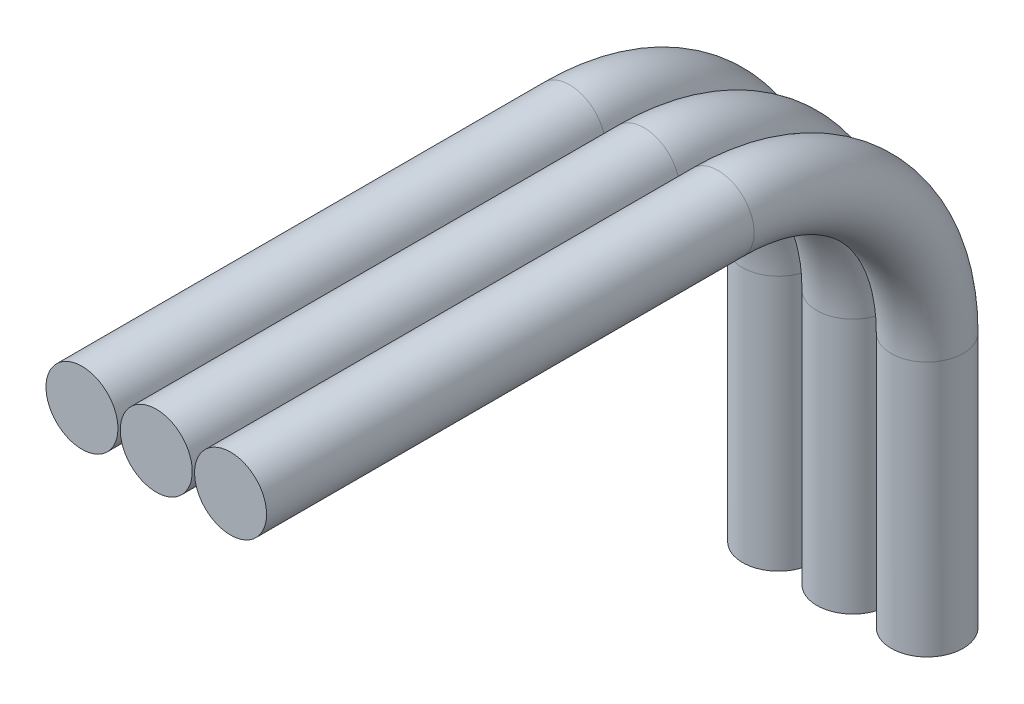
ISO-10303-21;
HEADER;
FILE_DESCRIPTION(('STEP AP214'),'2;1');
FILE_NAME('part.step','',(''),(''),'','','');
FILE_SCHEMA(('AUTOMOTIVE_DESIGN { 1 0 10303 214 1 1 1 1 }'));
ENDSEC;
DATA;
#1=APPLICATION_CONTEXT('core data for automotive mechanical design processes');
#2=APPLICATION_PROTOCOL_DEFINITION('international standard','automotive_design',2000,#1);
#3=PRODUCT_CONTEXT('',#1,'mechanical');
#4=PRODUCT('Part','Part','',(#3));
#5=PRODUCT_RELATED_PRODUCT_CATEGORY('part','',(#4));
#6=PRODUCT_DEFINITION_FORMATION('','',#4);
#7=PRODUCT_DEFINITION_CONTEXT('part definition',#1,'design');
#8=PRODUCT_DEFINITION('design','',#6,#7);
#9=PRODUCT_DEFINITION_SHAPE('','',#8);
#10=(LENGTH_UNIT() NAMED_UNIT(*) SI_UNIT(.MILLI.,.METRE.));
#11=(NAMED_UNIT(*) PLANE_ANGLE_UNIT() SI_UNIT($,.RADIAN.));
#12=(NAMED_UNIT(*) SI_UNIT($,.STERADIAN.) SOLID_ANGLE_UNIT());
#13=UNCERTAINTY_MEASURE_WITH_UNIT(LENGTH_MEASURE(1.E-05),#10,'distance_accuracy_value','');
#14=(GEOMETRIC_REPRESENTATION_CONTEXT(3) GLOBAL_UNCERTAINTY_ASSIGNED_CONTEXT((#13)) GLOBAL_UNIT_ASSIGNED_CONTEXT((#10,
#11,#12)) REPRESENTATION_CONTEXT('',''));
#15=CARTESIAN_POINT('',(0.,0.,0.));
#16=DIRECTION('',(0.,0.,1.));
#17=DIRECTION('',(1.,0.,0.));
#18=AXIS2_PLACEMENT_3D('',#15,#16,#17);
#19=CARTESIAN_POINT('',(6.4,0.,20.));
#20=DIRECTION('',(0.,0.,-1.));
#21=DIRECTION('',(-1.,0.,0.));
#22=AXIS2_PLACEMENT_3D('',#19,#20,#21);
#23=CYLINDRICAL_SURFACE('',#22,1.55);
#24=CARTESIAN_POINT('',(6.4,0.,20.));
#25=DIRECTION('',(0.,0.,1.));
#26=DIRECTION('',(1.,0.,0.));
#27=AXIS2_PLACEMENT_3D('',#24,#25,#26);
#28=CIRCLE('',#27,1.55);
#29=CARTESIAN_POINT('',(7.95,0.,20.));
#30=VERTEX_POINT('',#29);
#31=EDGE_CURVE('E12',#30,#30,#28,.T.);
#32=ORIENTED_EDGE('',*,*,#31,.F.);
#33=EDGE_LOOP('',(#32));
#34=FACE_BOUND('',#33,.T.);
#35=CARTESIAN_POINT('',(6.4,0.,-0.999999999999937));
#36=DIRECTION('',(0.,0.,1.));
#37=DIRECTION('',(1.,0.,0.));
#38=AXIS2_PLACEMENT_3D('',#35,#36,#37);
#39=CIRCLE('',#38,1.55);
#40=CARTESIAN_POINT('',(6.4,1.55,-0.999999999999925));
#41=VERTEX_POINT('',#40);
#42=EDGE_CURVE('E68',#41,#41,#39,.T.);
#43=ORIENTED_EDGE('',*,*,#42,.T.);
#44=EDGE_LOOP('',(#43));
#45=FACE_BOUND('',#44,.T.);
#46=ADVANCED_FACE('F50',(#34,#45),#23,.T.);
#47=CARTESIAN_POINT('',(6.4,0.,20.));
#48=DIRECTION('',(0.,0.,1.));
#49=DIRECTION('',(1.,0.,0.));
#50=AXIS2_PLACEMENT_3D('',#47,#48,#49);
#51=PLANE('',#50);
#52=ORIENTED_EDGE('',*,*,#31,.T.);
#53=EDGE_LOOP('',(#52));
#54=FACE_BOUND('',#53,.T.);
#55=ADVANCED_FACE('F86',(#54),#51,.T.);
#56=CARTESIAN_POINT('',(6.4,-20.,-10.));
#57=DIRECTION('',(0.,1.,0.));
#58=DIRECTION('',(1.,0.,0.));
#59=AXIS2_PLACEMENT_3D('',#56,#57,#58);
#60=PLANE('',#59);
#61=CARTESIAN_POINT('',(6.4,-20.,-10.));
#62=DIRECTION('',(0.,1.,0.));
#63=DIRECTION('',(1.,0.,0.));
#64=AXIS2_PLACEMENT_3D('',#61,#62,#63);
#65=CIRCLE('',#64,1.55);
#66=CARTESIAN_POINT('',(7.95,-20.,-10.));
#67=VERTEX_POINT('',#66);
#68=EDGE_CURVE('E57',#67,#67,#65,.T.);
#69=ORIENTED_EDGE('',*,*,#68,.F.);
#70=EDGE_LOOP('',(#69));
#71=FACE_BOUND('',#70,.T.);
#72=ADVANCED_FACE('F78',(#71),#60,.F.);
#73=CARTESIAN_POINT('',(6.4,-9.,-1.));
#74=DIRECTION('',(-1.,0.,0.));
#75=DIRECTION('',(0.,0.,1.));
#76=AXIS2_PLACEMENT_3D('',#73,#74,#75);
#77=TOROIDAL_SURFACE('',#76,9.,1.55);
#78=CARTESIAN_POINT('',(6.4,-9.,-10.));
#79=DIRECTION('',(0.,1.,0.));
#80=DIRECTION('',(1.,0.,0.));
#81=AXIS2_PLACEMENT_3D('',#78,#79,#80);
#82=CIRCLE('',#81,1.55);
#83=CARTESIAN_POINT('',(6.4,-9.,-11.55));
#84=VERTEX_POINT('',#83);
#85=EDGE_CURVE('E65',#84,#84,#82,.T.);
#86=CARTESIAN_POINT('',(6.4,-9.,-1.));
#87=DIRECTION('',(-1.,0.,0.));
#88=DIRECTION('',(0.,0.,1.));
#89=AXIS2_PLACEMENT_3D('',#86,#87,#88);
#90=CIRCLE('',#89,10.55);
#91=EDGE_CURVE('',#41,#84,#90,.T.);
#92=ORIENTED_EDGE('',*,*,#42,.F.);
#93=ORIENTED_EDGE('',*,*,#85,.T.);
#94=ORIENTED_EDGE('',*,*,#91,.T.);
#95=ORIENTED_EDGE('',*,*,#91,.F.);
#96=EDGE_LOOP('',(#92,#94,#93,#95));
#97=FACE_BOUND('',#96,.T.);
#98=ADVANCED_FACE('F76',(#97),#77,.T.);
#99=CARTESIAN_POINT('',(6.4,-9.00000000000006,-10.));
#100=DIRECTION('',(0.,-1.,0.));
#101=DIRECTION('',(0.,0.,-1.));
#102=AXIS2_PLACEMENT_3D('',#99,#100,#101);
#103=CYLINDRICAL_SURFACE('',#102,1.55);
#104=ORIENTED_EDGE('',*,*,#68,.T.);
#105=EDGE_LOOP('',(#104));
#106=FACE_BOUND('',#105,.T.);
#107=ORIENTED_EDGE('',*,*,#85,.F.);
#108=EDGE_LOOP('',(#107));
#109=FACE_BOUND('',#108,.T.);
#110=ADVANCED_FACE('F61',(#106,#109),#103,.T.);
#111=CLOSED_SHELL('',(#46,#55,#72,#98,#110));
#112=MANIFOLD_SOLID_BREP('B2',#111);
#113=CARTESIAN_POINT('',(3.2,0.,20.));
#114=DIRECTION('',(0.,0.,-1.));
#115=DIRECTION('',(-1.,0.,0.));
#116=AXIS2_PLACEMENT_3D('',#113,#114,#115);
#117=CYLINDRICAL_SURFACE('',#116,1.55);
#118=CARTESIAN_POINT('',(3.2,0.,20.));
#119=DIRECTION('',(0.,0.,1.));
#120=DIRECTION('',(1.,0.,0.));
#121=AXIS2_PLACEMENT_3D('',#118,#119,#120);
#122=CIRCLE('',#121,1.55);
#123=CARTESIAN_POINT('',(4.75,0.,20.));
#124=VERTEX_POINT('',#123);
#125=EDGE_CURVE('E48',#124,#124,#122,.T.);
#126=ORIENTED_EDGE('',*,*,#125,.F.);
#127=EDGE_LOOP('',(#126));
#128=FACE_BOUND('',#127,.T.);
#129=CARTESIAN_POINT('',(3.2,0.,-0.999999999999937));
#130=DIRECTION('',(0.,0.,1.));
#131=DIRECTION('',(1.,0.,0.));
#132=AXIS2_PLACEMENT_3D('',#129,#130,#131);
#133=CIRCLE('',#132,1.55);
#134=CARTESIAN_POINT('',(3.2,1.55,-0.999999999999925));
#135=VERTEX_POINT('',#134);
#136=EDGE_CURVE('E152',#135,#135,#133,.T.);
#137=ORIENTED_EDGE('',*,*,#136,.T.);
#138=EDGE_LOOP('',(#137));
#139=FACE_BOUND('',#138,.T.);
#140=ADVANCED_FACE('F137',(#128,#139),#117,.T.);
#141=CARTESIAN_POINT('',(3.2,0.,20.));
#142=DIRECTION('',(0.,0.,1.));
#143=DIRECTION('',(1.,0.,0.));
#144=AXIS2_PLACEMENT_3D('',#141,#142,#143);
#145=PLANE('',#144);
#146=ORIENTED_EDGE('',*,*,#125,.T.);
#147=EDGE_LOOP('',(#146));
#148=FACE_BOUND('',#147,.T.);
#149=ADVANCED_FACE('F169',(#148),#145,.T.);
#150=CARTESIAN_POINT('',(3.2,-20.,-10.));
#151=DIRECTION('',(0.,1.,0.));
#152=DIRECTION('',(1.,0.,0.));
#153=AXIS2_PLACEMENT_3D('',#150,#151,#152);
#154=PLANE('',#153);
#155=CARTESIAN_POINT('',(3.2,-20.,-10.));
#156=DIRECTION('',(0.,1.,0.));
#157=DIRECTION('',(1.,0.,0.));
#158=AXIS2_PLACEMENT_3D('',#155,#156,#157);
#159=CIRCLE('',#158,1.55);
#160=CARTESIAN_POINT('',(4.75,-20.,-10.));
#161=VERTEX_POINT('',#160);
#162=EDGE_CURVE('E143',#161,#161,#159,.T.);
#163=ORIENTED_EDGE('',*,*,#162,.F.);
#164=EDGE_LOOP('',(#163));
#165=FACE_BOUND('',#164,.T.);
#166=ADVANCED_FACE('F161',(#165),#154,.F.);
#167=CARTESIAN_POINT('',(3.2,-9.,-1.));
#168=DIRECTION('',(-1.,0.,0.));
#169=DIRECTION('',(0.,0.,1.));
#170=AXIS2_PLACEMENT_3D('',#167,#168,#169);
#171=TOROIDAL_SURFACE('',#170,9.,1.55);
#172=CARTESIAN_POINT('',(3.2,-9.,-10.));
#173=DIRECTION('',(0.,1.,0.));
#174=DIRECTION('',(1.,0.,0.));
#175=AXIS2_PLACEMENT_3D('',#172,#173,#174);
#176=CIRCLE('',#175,1.55);
#177=CARTESIAN_POINT('',(3.2,-9.,-11.55));
#178=VERTEX_POINT('',#177);
#179=EDGE_CURVE('E150',#178,#178,#176,.T.);
#180=CARTESIAN_POINT('',(3.2,-9.,-1.));
#181=DIRECTION('',(-1.,0.,0.));
#182=DIRECTION('',(0.,0.,1.));
#183=AXIS2_PLACEMENT_3D('',#180,#181,#182);
#184=CIRCLE('',#183,10.55);
#185=EDGE_CURVE('',#135,#178,#184,.T.);
#186=ORIENTED_EDGE('',*,*,#136,.F.);
#187=ORIENTED_EDGE('',*,*,#179,.T.);
#188=ORIENTED_EDGE('',*,*,#185,.T.);
#189=ORIENTED_EDGE('',*,*,#185,.F.);
#190=EDGE_LOOP('',(#186,#188,#187,#189));
#191=FACE_BOUND('',#190,.T.);
#192=ADVANCED_FACE('F159',(#191),#171,.T.);
#193=CARTESIAN_POINT('',(3.2,-9.00000000000006,-10.));
#194=DIRECTION('',(0.,-1.,0.));
#195=DIRECTION('',(0.,0.,-1.));
#196=AXIS2_PLACEMENT_3D('',#193,#194,#195);
#197=CYLINDRICAL_SURFACE('',#196,1.55);
#198=ORIENTED_EDGE('',*,*,#162,.T.);
#199=EDGE_LOOP('',(#198));
#200=FACE_BOUND('',#199,.T.);
#201=ORIENTED_EDGE('',*,*,#179,.F.);
#202=EDGE_LOOP('',(#201));
#203=FACE_BOUND('',#202,.T.);
#204=ADVANCED_FACE('F147',(#200,#203),#197,.T.);
#205=CLOSED_SHELL('',(#140,#149,#166,#192,#204));
#206=MANIFOLD_SOLID_BREP('B6',#205);
#207=CARTESIAN_POINT('',(0.,0.,20.));
#208=DIRECTION('',(0.,0.,-1.));
#209=DIRECTION('',(-1.,0.,0.));
#210=AXIS2_PLACEMENT_3D('',#207,#208,#209);
#211=CYLINDRICAL_SURFACE('',#210,1.55);
#212=CARTESIAN_POINT('',(0.,0.,20.));
#213=DIRECTION('',(0.,0.,1.));
#214=DIRECTION('',(1.,0.,0.));
#215=AXIS2_PLACEMENT_3D('',#212,#213,#214);
#216=CIRCLE('',#215,1.55);
#217=CARTESIAN_POINT('',(1.55,0.,20.));
#218=VERTEX_POINT('',#217);
#219=EDGE_CURVE('E135',#218,#218,#216,.T.);
#220=ORIENTED_EDGE('',*,*,#219,.F.);
#221=EDGE_LOOP('',(#220));
#222=FACE_BOUND('',#221,.T.);
#223=CARTESIAN_POINT('',(0.,0.,-0.999999999999937));
#224=DIRECTION('',(0.,0.,1.));
#225=DIRECTION('',(1.,0.,0.));
#226=AXIS2_PLACEMENT_3D('',#223,#224,#225);
#227=CIRCLE('',#226,1.55);
#228=CARTESIAN_POINT('',(0.,1.55,-0.999999999999925));
#229=VERTEX_POINT('',#228);
#230=EDGE_CURVE('E226',#229,#229,#227,.T.);
#231=ORIENTED_EDGE('',*,*,#230,.T.);
#232=EDGE_LOOP('',(#231));
#233=FACE_BOUND('',#232,.T.);
#234=ADVANCED_FACE('F211',(#222,#233),#211,.T.);
#235=CARTESIAN_POINT('',(0.,0.,20.));
#236=DIRECTION('',(0.,0.,1.));
#237=DIRECTION('',(1.,0.,0.));
#238=AXIS2_PLACEMENT_3D('',#235,#236,#237);
#239=PLANE('',#238);
#240=ORIENTED_EDGE('',*,*,#219,.T.);
#241=EDGE_LOOP('',(#240));
#242=FACE_BOUND('',#241,.T.);
#243=ADVANCED_FACE('F243',(#242),#239,.T.);
#244=CARTESIAN_POINT('',(0.,-20.,-10.));
#245=DIRECTION('',(0.,1.,0.));
#246=DIRECTION('',(1.,0.,0.));
#247=AXIS2_PLACEMENT_3D('',#244,#245,#246);
#248=PLANE('',#247);
#249=CARTESIAN_POINT('',(0.,-20.,-10.));
#250=DIRECTION('',(0.,1.,0.));
#251=DIRECTION('',(1.,0.,0.));
#252=AXIS2_PLACEMENT_3D('',#249,#250,#251);
#253=CIRCLE('',#252,1.55);
#254=CARTESIAN_POINT('',(1.55,-20.,-10.));
#255=VERTEX_POINT('',#254);
#256=EDGE_CURVE('E217',#255,#255,#253,.T.);
#257=ORIENTED_EDGE('',*,*,#256,.F.);
#258=EDGE_LOOP('',(#257));
#259=FACE_BOUND('',#258,.T.);
#260=ADVANCED_FACE('F235',(#259),#248,.F.);
#261=CARTESIAN_POINT('',(0.,-9.,-1.));
#262=DIRECTION('',(-1.,0.,0.));
#263=DIRECTION('',(0.,0.,1.));
#264=AXIS2_PLACEMENT_3D('',#261,#262,#263);
#265=TOROIDAL_SURFACE('',#264,9.,1.55);
#266=CARTESIAN_POINT('',(0.,-9.,-10.));
#267=DIRECTION('',(0.,1.,0.));
#268=DIRECTION('',(1.,0.,0.));
#269=AXIS2_PLACEMENT_3D('',#266,#267,#268);
#270=CIRCLE('',#269,1.55);
#271=CARTESIAN_POINT('',(0.,-9.,-11.55));
#272=VERTEX_POINT('',#271);
#273=EDGE_CURVE('E224',#272,#272,#270,.T.);
#274=CARTESIAN_POINT('',(0.,-9.,-1.));
#275=DIRECTION('',(-1.,0.,0.));
#276=DIRECTION('',(0.,0.,1.));
#277=AXIS2_PLACEMENT_3D('',#274,#275,#276);
#278=CIRCLE('',#277,10.55);
#279=EDGE_CURVE('',#229,#272,#278,.T.);
#280=ORIENTED_EDGE('',*,*,#230,.F.);
#281=ORIENTED_EDGE('',*,*,#273,.T.);
#282=ORIENTED_EDGE('',*,*,#279,.T.);
#283=ORIENTED_EDGE('',*,*,#279,.F.);
#284=EDGE_LOOP('',(#280,#282,#281,#283));
#285=FACE_BOUND('',#284,.T.);
#286=ADVANCED_FACE('F233',(#285),#265,.T.);
#287=CARTESIAN_POINT('',(0.,-9.00000000000006,-10.));
#288=DIRECTION('',(0.,-1.,0.));
#289=DIRECTION('',(0.,0.,-1.));
#290=AXIS2_PLACEMENT_3D('',#287,#288,#289);
#291=CYLINDRICAL_SURFACE('',#290,1.55);
#292=ORIENTED_EDGE('',*,*,#256,.T.);
#293=EDGE_LOOP('',(#292));
#294=FACE_BOUND('',#293,.T.);
#295=ORIENTED_EDGE('',*,*,#273,.F.);
#296=EDGE_LOOP('',(#295));
#297=FACE_BOUND('',#296,.T.);
#298=ADVANCED_FACE('F221',(#294,#297),#291,.T.);
#299=CLOSED_SHELL('',(#234,#243,#260,#286,#298));
#300=MANIFOLD_SOLID_BREP('B42',#299);
#301=ADVANCED_BREP_SHAPE_REPRESENTATION('',(#18,#112,#206,#300),#14);
#302=SHAPE_DEFINITION_REPRESENTATION(#9,#301);
ENDSEC;
END-ISO-10303-21;
